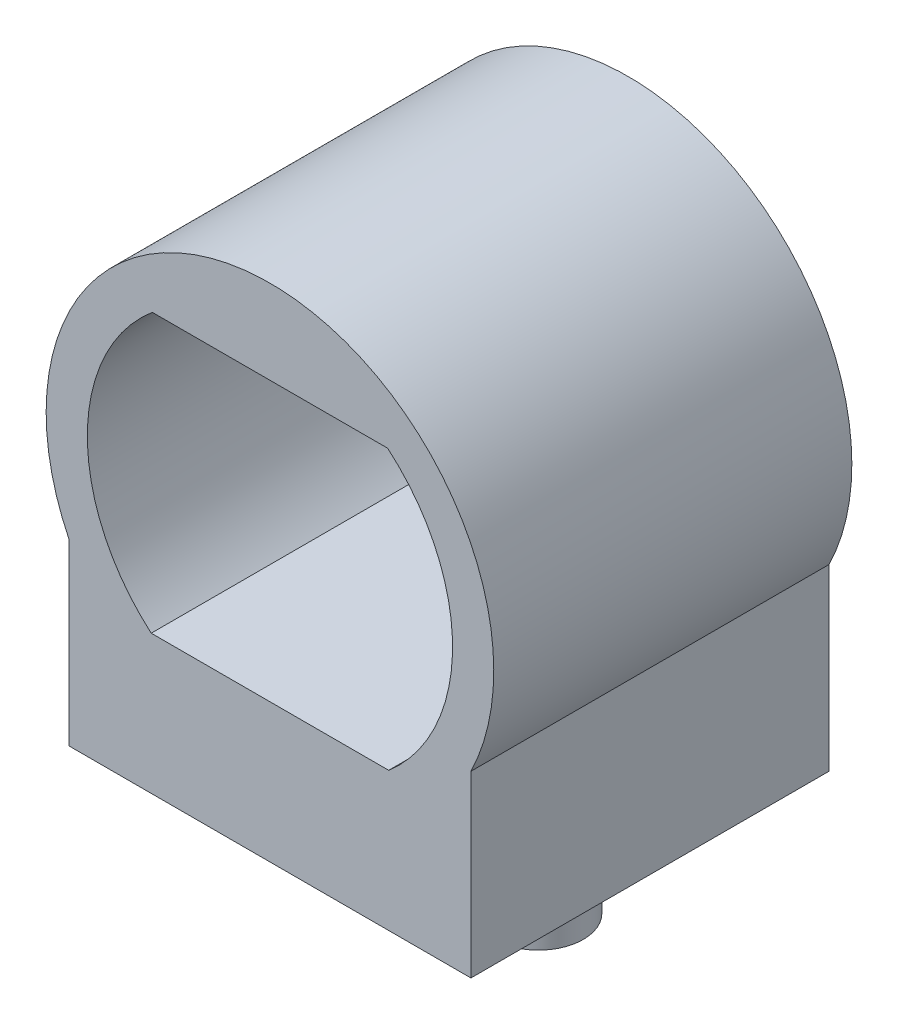
ISO-10303-21;
HEADER;
FILE_DESCRIPTION(('STEP AP214'),'2;1');
FILE_NAME('part.step','',(''),(''),'','','');
FILE_SCHEMA(('AUTOMOTIVE_DESIGN { 1 0 10303 214 1 1 1 1 }'));
ENDSEC;
DATA;
#1=APPLICATION_CONTEXT('core data for automotive mechanical design processes');
#2=APPLICATION_PROTOCOL_DEFINITION('international standard','automotive_design',2000,#1);
#3=PRODUCT_CONTEXT('',#1,'mechanical');
#4=PRODUCT('Part','Part','',(#3));
#5=PRODUCT_RELATED_PRODUCT_CATEGORY('part','',(#4));
#6=PRODUCT_DEFINITION_FORMATION('','',#4);
#7=PRODUCT_DEFINITION_CONTEXT('part definition',#1,'design');
#8=PRODUCT_DEFINITION('design','',#6,#7);
#9=PRODUCT_DEFINITION_SHAPE('','',#8);
#10=(LENGTH_UNIT() NAMED_UNIT(*) SI_UNIT(.MILLI.,.METRE.));
#11=(NAMED_UNIT(*) PLANE_ANGLE_UNIT() SI_UNIT($,.RADIAN.));
#12=(NAMED_UNIT(*) SI_UNIT($,.STERADIAN.) SOLID_ANGLE_UNIT());
#13=UNCERTAINTY_MEASURE_WITH_UNIT(LENGTH_MEASURE(1.E-05),#10,'distance_accuracy_value','');
#14=(GEOMETRIC_REPRESENTATION_CONTEXT(3) GLOBAL_UNCERTAINTY_ASSIGNED_CONTEXT((#13)) GLOBAL_UNIT_ASSIGNED_CONTEXT((#10,
#11,#12)) REPRESENTATION_CONTEXT('',''));
#15=CARTESIAN_POINT('',(0.,0.,0.));
#16=DIRECTION('',(0.,0.,1.));
#17=DIRECTION('',(1.,0.,0.));
#18=AXIS2_PLACEMENT_3D('',#15,#16,#17);
#19=CARTESIAN_POINT('',(0.,0.,0.));
#20=DIRECTION('',(0.,0.,1.));
#21=DIRECTION('',(1.,0.,0.));
#22=AXIS2_PLACEMENT_3D('',#19,#20,#21);
#23=PLANE('',#22);
#24=CARTESIAN_POINT('',(0.,0.,0.));
#25=DIRECTION('',(0.,0.,1.));
#26=DIRECTION('',(1.,0.,0.));
#27=AXIS2_PLACEMENT_3D('',#24,#25,#26);
#28=CIRCLE('',#27,10.2);
#29=CARTESIAN_POINT('',(6.63155336252375,-7.75,0.));
#30=VERTEX_POINT('',#29);
#31=CARTESIAN_POINT('',(6.572670690062,7.8,0.));
#32=VERTEX_POINT('',#31);
#33=EDGE_CURVE('E67',#30,#32,#28,.T.);
#34=ORIENTED_EDGE('',*,*,#33,.F.);
#35=DIRECTION('',(1.,0.,0.));
#36=VECTOR('',#35,1.);
#37=CARTESIAN_POINT('',(0.,-7.75,0.));
#38=LINE('',#37,#36);
#39=CARTESIAN_POINT('',(-6.63155336252375,-7.75,0.));
#40=VERTEX_POINT('',#39);
#41=EDGE_CURVE('E125',#40,#30,#38,.T.);
#42=ORIENTED_EDGE('',*,*,#41,.F.);
#43=CARTESIAN_POINT('',(-6.572670690062,7.8,0.));
#44=VERTEX_POINT('',#43);
#45=EDGE_CURVE('E145',#44,#40,#28,.T.);
#46=ORIENTED_EDGE('',*,*,#45,.F.);
#47=DIRECTION('',(-1.,0.,0.));
#48=VECTOR('',#47,1.);
#49=CARTESIAN_POINT('',(0.,7.8,0.));
#50=LINE('',#49,#48);
#51=EDGE_CURVE('E143',#32,#44,#50,.T.);
#52=ORIENTED_EDGE('',*,*,#51,.F.);
#53=EDGE_LOOP('',(#34,#42,#46,#52));
#54=FACE_BOUND('',#53,.T.);
#55=CARTESIAN_POINT('',(0.,0.,0.));
#56=DIRECTION('',(0.,0.,1.));
#57=DIRECTION('',(1.,0.,0.));
#58=AXIS2_PLACEMENT_3D('',#55,#56,#57);
#59=CIRCLE('',#58,12.5);
#60=CARTESIAN_POINT('',(11.2249721603218,-5.5,0.));
#61=VERTEX_POINT('',#60);
#62=CARTESIAN_POINT('',(-11.2249721603218,-5.5,0.));
#63=VERTEX_POINT('',#62);
#64=EDGE_CURVE('E132',#61,#63,#59,.T.);
#65=ORIENTED_EDGE('',*,*,#64,.T.);
#66=DIRECTION('',(0.,-1.,0.));
#67=VECTOR('',#66,1.);
#68=CARTESIAN_POINT('',(-11.2249721603218,0.,0.));
#69=LINE('',#68,#67);
#70=CARTESIAN_POINT('',(-11.2249721603218,-15.5,0.));
#71=VERTEX_POINT('',#70);
#72=EDGE_CURVE('E180',#63,#71,#69,.T.);
#73=ORIENTED_EDGE('',*,*,#72,.T.);
#74=DIRECTION('',(1.,0.,0.));
#75=VECTOR('',#74,1.);
#76=CARTESIAN_POINT('',(0.,-15.5,0.));
#77=LINE('',#76,#75);
#78=CARTESIAN_POINT('',(11.2249721603218,-15.5,0.));
#79=VERTEX_POINT('',#78);
#80=EDGE_CURVE('E184',#71,#79,#77,.T.);
#81=ORIENTED_EDGE('',*,*,#80,.T.);
#82=DIRECTION('',(0.,-1.,0.));
#83=VECTOR('',#82,1.);
#84=CARTESIAN_POINT('',(11.2249721603218,0.,0.));
#85=LINE('',#84,#83);
#86=EDGE_CURVE('E166',#61,#79,#85,.T.);
#87=ORIENTED_EDGE('',*,*,#86,.F.);
#88=EDGE_LOOP('',(#65,#73,#81,#87));
#89=FACE_BOUND('',#88,.T.);
#90=ADVANCED_FACE('F49',(#54,#89),#23,.T.);
#91=CARTESIAN_POINT('',(0.,0.,-20.));
#92=DIRECTION('',(0.,0.,1.));
#93=DIRECTION('',(1.,0.,0.));
#94=AXIS2_PLACEMENT_3D('',#91,#92,#93);
#95=CYLINDRICAL_SURFACE('',#94,12.5);
#96=ORIENTED_EDGE('',*,*,#64,.F.);
#97=DIRECTION('',(0.,0.,1.));
#98=VECTOR('',#97,1.);
#99=CARTESIAN_POINT('',(11.2249721603218,-5.5,-20.));
#100=LINE('',#99,#98);
#101=CARTESIAN_POINT('',(11.2249721603218,-5.5,-20.));
#102=VERTEX_POINT('',#101);
#103=EDGE_CURVE('E11',#102,#61,#100,.T.);
#104=ORIENTED_EDGE('',*,*,#103,.F.);
#105=CARTESIAN_POINT('',(0.,0.,-20.));
#106=DIRECTION('',(0.,0.,1.));
#107=DIRECTION('',(1.,0.,0.));
#108=AXIS2_PLACEMENT_3D('',#105,#106,#107);
#109=CIRCLE('',#108,12.5);
#110=CARTESIAN_POINT('',(-11.2249721603218,-5.5,-20.));
#111=VERTEX_POINT('',#110);
#112=EDGE_CURVE('E161',#102,#111,#109,.T.);
#113=ORIENTED_EDGE('',*,*,#112,.T.);
#114=DIRECTION('',(0.,0.,1.));
#115=VECTOR('',#114,1.);
#116=CARTESIAN_POINT('',(-11.2249721603218,-5.5,-20.));
#117=LINE('',#116,#115);
#118=EDGE_CURVE('E53',#111,#63,#117,.T.);
#119=ORIENTED_EDGE('',*,*,#118,.T.);
#120=EDGE_LOOP('',(#96,#104,#113,#119));
#121=FACE_BOUND('',#120,.T.);
#122=ADVANCED_FACE('F51',(#121),#95,.T.);
#123=CARTESIAN_POINT('',(11.2249721603218,0.,-20.));
#124=DIRECTION('',(-1.,0.,0.));
#125=DIRECTION('',(0.,-1.,0.));
#126=AXIS2_PLACEMENT_3D('',#123,#124,#125);
#127=PLANE('',#126);
#128=ORIENTED_EDGE('',*,*,#86,.T.);
#129=DIRECTION('',(0.,0.,1.));
#130=VECTOR('',#129,1.);
#131=CARTESIAN_POINT('',(11.2249721603218,-15.5,-20.));
#132=LINE('',#131,#130);
#133=CARTESIAN_POINT('',(11.2249721603218,-15.5,-20.));
#134=VERTEX_POINT('',#133);
#135=EDGE_CURVE('E59',#134,#79,#132,.T.);
#136=ORIENTED_EDGE('',*,*,#135,.F.);
#137=DIRECTION('',(0.,-1.,0.));
#138=VECTOR('',#137,1.);
#139=CARTESIAN_POINT('',(11.2249721603218,0.,-20.));
#140=LINE('',#139,#138);
#141=EDGE_CURVE('E174',#102,#134,#140,.T.);
#142=ORIENTED_EDGE('',*,*,#141,.F.);
#143=ORIENTED_EDGE('',*,*,#103,.T.);
#144=EDGE_LOOP('',(#128,#136,#142,#143));
#145=FACE_BOUND('',#144,.T.);
#146=ADVANCED_FACE('F207',(#145),#127,.F.);
#147=CARTESIAN_POINT('',(0.,-15.5,-20.));
#148=DIRECTION('',(0.,-1.,0.));
#149=DIRECTION('',(0.,0.,-1.));
#150=AXIS2_PLACEMENT_3D('',#147,#148,#149);
#151=PLANE('',#150);
#152=CARTESIAN_POINT('',(5.,-15.5,-10.));
#153=DIRECTION('',(0.,-1.,0.));
#154=DIRECTION('',(0.,0.,1.));
#155=AXIS2_PLACEMENT_3D('',#152,#153,#154);
#156=CIRCLE('',#155,2.5);
#157=CARTESIAN_POINT('',(5.,-15.5,-7.5));
#158=VERTEX_POINT('',#157);
#159=EDGE_CURVE('E262',#158,#158,#156,.T.);
#160=ORIENTED_EDGE('',*,*,#159,.F.);
#161=EDGE_LOOP('',(#160));
#162=FACE_BOUND('',#161,.T.);
#163=CARTESIAN_POINT('',(-5.,-15.5,-10.));
#164=DIRECTION('',(0.,-1.,0.));
#165=DIRECTION('',(0.,0.,-1.));
#166=AXIS2_PLACEMENT_3D('',#163,#164,#165);
#167=CIRCLE('',#166,2.5);
#168=CARTESIAN_POINT('',(-5.,-15.5,-12.5));
#169=VERTEX_POINT('',#168);
#170=EDGE_CURVE('E264',#169,#169,#167,.T.);
#171=ORIENTED_EDGE('',*,*,#170,.F.);
#172=EDGE_LOOP('',(#171));
#173=FACE_BOUND('',#172,.T.);
#174=ORIENTED_EDGE('',*,*,#80,.F.);
#175=DIRECTION('',(0.,0.,1.));
#176=VECTOR('',#175,1.);
#177=CARTESIAN_POINT('',(-11.2249721603218,-15.5,-20.));
#178=LINE('',#177,#176);
#179=CARTESIAN_POINT('',(-11.2249721603218,-15.5,-20.));
#180=VERTEX_POINT('',#179);
#181=EDGE_CURVE('E192',#180,#71,#178,.T.);
#182=ORIENTED_EDGE('',*,*,#181,.F.);
#183=DIRECTION('',(1.,0.,0.));
#184=VECTOR('',#183,1.);
#185=CARTESIAN_POINT('',(0.,-15.5,-20.));
#186=LINE('',#185,#184);
#187=EDGE_CURVE('E170',#180,#134,#186,.T.);
#188=ORIENTED_EDGE('',*,*,#187,.T.);
#189=ORIENTED_EDGE('',*,*,#135,.T.);
#190=EDGE_LOOP('',(#174,#182,#188,#189));
#191=FACE_BOUND('',#190,.T.);
#192=ADVANCED_FACE('F211',(#162,#173,#191),#151,.T.);
#193=CARTESIAN_POINT('',(-11.2249721603218,0.,-20.));
#194=DIRECTION('',(-1.,0.,0.));
#195=DIRECTION('',(0.,-1.,0.));
#196=AXIS2_PLACEMENT_3D('',#193,#194,#195);
#197=PLANE('',#196);
#198=ORIENTED_EDGE('',*,*,#72,.F.);
#199=ORIENTED_EDGE('',*,*,#118,.F.);
#200=DIRECTION('',(0.,-1.,0.));
#201=VECTOR('',#200,1.);
#202=CARTESIAN_POINT('',(-11.2249721603218,0.,-20.));
#203=LINE('',#202,#201);
#204=EDGE_CURVE('E165',#111,#180,#203,.T.);
#205=ORIENTED_EDGE('',*,*,#204,.T.);
#206=ORIENTED_EDGE('',*,*,#181,.T.);
#207=EDGE_LOOP('',(#198,#199,#205,#206));
#208=FACE_BOUND('',#207,.T.);
#209=ADVANCED_FACE('F202',(#208),#197,.T.);
#210=CARTESIAN_POINT('',(0.,0.,-20.));
#211=DIRECTION('',(0.,0.,1.));
#212=DIRECTION('',(1.,0.,0.));
#213=AXIS2_PLACEMENT_3D('',#210,#211,#212);
#214=PLANE('',#213);
#215=DIRECTION('',(-1.,0.,0.));
#216=VECTOR('',#215,1.);
#217=CARTESIAN_POINT('',(0.,-7.75,-20.));
#218=LINE('',#217,#216);
#219=CARTESIAN_POINT('',(6.63155336252375,-7.75,-20.));
#220=VERTEX_POINT('',#219);
#221=CARTESIAN_POINT('',(-6.63155336252375,-7.75,-20.));
#222=VERTEX_POINT('',#221);
#223=EDGE_CURVE('E138',#220,#222,#218,.T.);
#224=ORIENTED_EDGE('',*,*,#223,.F.);
#225=CARTESIAN_POINT('',(0.,0.,-20.));
#226=DIRECTION('',(0.,0.,1.));
#227=DIRECTION('',(1.,0.,0.));
#228=AXIS2_PLACEMENT_3D('',#225,#226,#227);
#229=CIRCLE('',#228,10.2);
#230=CARTESIAN_POINT('',(6.572670690062,7.8,-20.));
#231=VERTEX_POINT('',#230);
#232=EDGE_CURVE('E118',#231,#220,#229,.F.);
#233=ORIENTED_EDGE('',*,*,#232,.F.);
#234=DIRECTION('',(1.,0.,0.));
#235=VECTOR('',#234,1.);
#236=CARTESIAN_POINT('',(0.,7.8,-20.));
#237=LINE('',#236,#235);
#238=CARTESIAN_POINT('',(-6.572670690062,7.8,-20.));
#239=VERTEX_POINT('',#238);
#240=EDGE_CURVE('E128',#239,#231,#237,.T.);
#241=ORIENTED_EDGE('',*,*,#240,.F.);
#242=CARTESIAN_POINT('',(0.,0.,-20.));
#243=DIRECTION('',(0.,0.,1.));
#244=DIRECTION('',(1.,0.,0.));
#245=AXIS2_PLACEMENT_3D('',#242,#243,#244);
#246=CIRCLE('',#245,10.2);
#247=EDGE_CURVE('E75',#222,#239,#246,.F.);
#248=ORIENTED_EDGE('',*,*,#247,.F.);
#249=EDGE_LOOP('',(#224,#233,#241,#248));
#250=FACE_BOUND('',#249,.T.);
#251=ORIENTED_EDGE('',*,*,#112,.F.);
#252=ORIENTED_EDGE('',*,*,#141,.T.);
#253=ORIENTED_EDGE('',*,*,#187,.F.);
#254=ORIENTED_EDGE('',*,*,#204,.F.);
#255=EDGE_LOOP('',(#251,#252,#253,#254));
#256=FACE_BOUND('',#255,.T.);
#257=ADVANCED_FACE('F135',(#250,#256),#214,.F.);
#258=CARTESIAN_POINT('',(0.,0.,-20.0940986764331));
#259=DIRECTION('',(0.,0.,1.));
#260=DIRECTION('',(1.,0.,0.));
#261=AXIS2_PLACEMENT_3D('',#258,#259,#260);
#262=CYLINDRICAL_SURFACE('',#261,10.2);
#263=ORIENTED_EDGE('',*,*,#232,.T.);
#264=DIRECTION('',(0.,0.,1.));
#265=VECTOR('',#264,1.);
#266=CARTESIAN_POINT('',(6.63155336252375,-7.75,-20.0940986764331));
#267=LINE('',#266,#265);
#268=EDGE_CURVE('E133',#220,#30,#267,.T.);
#269=ORIENTED_EDGE('',*,*,#268,.T.);
#270=ORIENTED_EDGE('',*,*,#33,.T.);
#271=DIRECTION('',(0.,0.,1.));
#272=VECTOR('',#271,1.);
#273=CARTESIAN_POINT('',(6.572670690062,7.8,-20.0940986764331));
#274=LINE('',#273,#272);
#275=EDGE_CURVE('E114',#231,#32,#274,.T.);
#276=ORIENTED_EDGE('',*,*,#275,.F.);
#277=EDGE_LOOP('',(#263,#269,#270,#276));
#278=FACE_BOUND('',#277,.T.);
#279=ADVANCED_FACE('F116',(#278),#262,.F.);
#280=CARTESIAN_POINT('',(0.,-7.75,-20.0940986764331));
#281=DIRECTION('',(0.,-1.,0.));
#282=DIRECTION('',(0.,0.,-1.));
#283=AXIS2_PLACEMENT_3D('',#280,#281,#282);
#284=PLANE('',#283);
#285=ORIENTED_EDGE('',*,*,#223,.T.);
#286=DIRECTION('',(0.,0.,1.));
#287=VECTOR('',#286,1.);
#288=CARTESIAN_POINT('',(-6.63155336252375,-7.75,-20.0940986764331));
#289=LINE('',#288,#287);
#290=EDGE_CURVE('E156',#222,#40,#289,.T.);
#291=ORIENTED_EDGE('',*,*,#290,.T.);
#292=ORIENTED_EDGE('',*,*,#41,.T.);
#293=ORIENTED_EDGE('',*,*,#268,.F.);
#294=EDGE_LOOP('',(#285,#291,#292,#293));
#295=FACE_BOUND('',#294,.T.);
#296=ADVANCED_FACE('F238',(#295),#284,.F.);
#297=ORIENTED_EDGE('',*,*,#247,.T.);
#298=DIRECTION('',(0.,0.,1.));
#299=VECTOR('',#298,1.);
#300=CARTESIAN_POINT('',(-6.572670690062,7.8,-20.0940986764331));
#301=LINE('',#300,#299);
#302=EDGE_CURVE('E124',#239,#44,#301,.T.);
#303=ORIENTED_EDGE('',*,*,#302,.T.);
#304=ORIENTED_EDGE('',*,*,#45,.T.);
#305=ORIENTED_EDGE('',*,*,#290,.F.);
#306=EDGE_LOOP('',(#297,#303,#304,#305));
#307=FACE_BOUND('',#306,.T.);
#308=ADVANCED_FACE('F235',(#307),#262,.F.);
#309=CARTESIAN_POINT('',(0.,7.8,-20.0940986764331));
#310=DIRECTION('',(0.,1.,0.));
#311=DIRECTION('',(0.,0.,1.));
#312=AXIS2_PLACEMENT_3D('',#309,#310,#311);
#313=PLANE('',#312);
#314=ORIENTED_EDGE('',*,*,#240,.T.);
#315=ORIENTED_EDGE('',*,*,#275,.T.);
#316=ORIENTED_EDGE('',*,*,#51,.T.);
#317=ORIENTED_EDGE('',*,*,#302,.F.);
#318=EDGE_LOOP('',(#314,#315,#316,#317));
#319=FACE_BOUND('',#318,.T.);
#320=ADVANCED_FACE('F129',(#319),#313,.F.);
#321=CARTESIAN_POINT('',(-5.,-20.5,-10.));
#322=DIRECTION('',(0.,1.,0.));
#323=DIRECTION('',(0.,0.,1.));
#324=AXIS2_PLACEMENT_3D('',#321,#322,#323);
#325=CYLINDRICAL_SURFACE('',#324,2.5);
#326=CARTESIAN_POINT('',(-5.,-20.5,-10.));
#327=DIRECTION('',(0.,-1.,0.));
#328=DIRECTION('',(0.,0.,-1.));
#329=AXIS2_PLACEMENT_3D('',#326,#327,#328);
#330=CIRCLE('',#329,2.5);
#331=CARTESIAN_POINT('',(-5.,-20.5,-12.5));
#332=VERTEX_POINT('',#331);
#333=EDGE_CURVE('E269',#332,#332,#330,.T.);
#334=ORIENTED_EDGE('',*,*,#333,.F.);
#335=EDGE_LOOP('',(#334));
#336=FACE_BOUND('',#335,.T.);
#337=ORIENTED_EDGE('',*,*,#170,.T.);
#338=EDGE_LOOP('',(#337));
#339=FACE_BOUND('',#338,.T.);
#340=ADVANCED_FACE('F234',(#336,#339),#325,.T.);
#341=CARTESIAN_POINT('',(-5.,-20.5,-10.));
#342=DIRECTION('',(0.,-1.,0.));
#343=DIRECTION('',(0.,0.,-1.));
#344=AXIS2_PLACEMENT_3D('',#341,#342,#343);
#345=PLANE('',#344);
#346=ORIENTED_EDGE('',*,*,#333,.T.);
#347=EDGE_LOOP('',(#346));
#348=FACE_BOUND('',#347,.T.);
#349=ADVANCED_FACE('F243',(#348),#345,.T.);
#350=CARTESIAN_POINT('',(5.,-20.5,-10.));
#351=DIRECTION('',(0.,1.,0.));
#352=DIRECTION('',(0.,0.,1.));
#353=AXIS2_PLACEMENT_3D('',#350,#351,#352);
#354=CYLINDRICAL_SURFACE('',#353,2.5);
#355=CARTESIAN_POINT('',(5.,-20.5,-10.));
#356=DIRECTION('',(0.,-1.,0.));
#357=DIRECTION('',(0.,0.,1.));
#358=AXIS2_PLACEMENT_3D('',#355,#356,#357);
#359=CIRCLE('',#358,2.5);
#360=CARTESIAN_POINT('',(5.,-20.5,-7.5));
#361=VERTEX_POINT('',#360);
#362=EDGE_CURVE('E260',#361,#361,#359,.T.);
#363=ORIENTED_EDGE('',*,*,#362,.F.);
#364=EDGE_LOOP('',(#363));
#365=FACE_BOUND('',#364,.T.);
#366=ORIENTED_EDGE('',*,*,#159,.T.);
#367=EDGE_LOOP('',(#366));
#368=FACE_BOUND('',#367,.T.);
#369=ADVANCED_FACE('F247',(#365,#368),#354,.T.);
#370=CARTESIAN_POINT('',(5.,-20.5,-10.));
#371=DIRECTION('',(0.,1.,0.));
#372=DIRECTION('',(0.,0.,1.));
#373=AXIS2_PLACEMENT_3D('',#370,#371,#372);
#374=PLANE('',#373);
#375=ORIENTED_EDGE('',*,*,#362,.T.);
#376=EDGE_LOOP('',(#375));
#377=FACE_BOUND('',#376,.T.);
#378=ADVANCED_FACE('F249',(#377),#374,.F.);
#379=CLOSED_SHELL('',(#90,#122,#146,#192,#209,#257,#279,#296,#308,#320,#340,#349,#369,#378));
#380=MANIFOLD_SOLID_BREP('B2',#379);
#381=ADVANCED_BREP_SHAPE_REPRESENTATION('',(#18,#380),#14);
#382=SHAPE_DEFINITION_REPRESENTATION(#9,#381);
ENDSEC;
END-ISO-10303-21;
